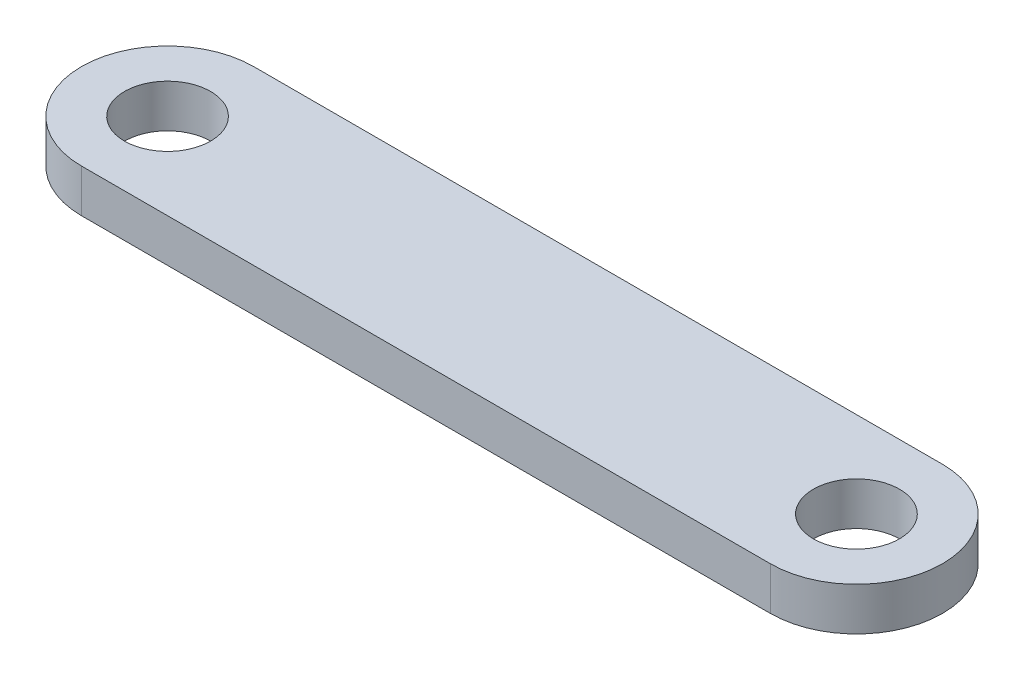
ISO-10303-21;
HEADER;
FILE_DESCRIPTION(('STEP AP214'),'2;1');
FILE_NAME('part.step','',(''),(''),'','','');
FILE_SCHEMA(('AUTOMOTIVE_DESIGN { 1 0 10303 214 1 1 1 1 }'));
ENDSEC;
DATA;
#1=APPLICATION_CONTEXT('core data for automotive mechanical design processes');
#2=APPLICATION_PROTOCOL_DEFINITION('international standard','automotive_design',2000,#1);
#3=PRODUCT_CONTEXT('',#1,'mechanical');
#4=PRODUCT('Part','Part','',(#3));
#5=PRODUCT_RELATED_PRODUCT_CATEGORY('part','',(#4));
#6=PRODUCT_DEFINITION_FORMATION('','',#4);
#7=PRODUCT_DEFINITION_CONTEXT('part definition',#1,'design');
#8=PRODUCT_DEFINITION('design','',#6,#7);
#9=PRODUCT_DEFINITION_SHAPE('','',#8);
#10=(LENGTH_UNIT() NAMED_UNIT(*) SI_UNIT(.MILLI.,.METRE.));
#11=(NAMED_UNIT(*) PLANE_ANGLE_UNIT() SI_UNIT($,.RADIAN.));
#12=(NAMED_UNIT(*) SI_UNIT($,.STERADIAN.) SOLID_ANGLE_UNIT());
#13=UNCERTAINTY_MEASURE_WITH_UNIT(LENGTH_MEASURE(1.E-05),#10,'distance_accuracy_value','');
#14=(GEOMETRIC_REPRESENTATION_CONTEXT(3) GLOBAL_UNCERTAINTY_ASSIGNED_CONTEXT((#13)) GLOBAL_UNIT_ASSIGNED_CONTEXT((#10,
#11,#12)) REPRESENTATION_CONTEXT('',''));
#15=CARTESIAN_POINT('',(0.,0.,0.));
#16=DIRECTION('',(0.,0.,1.));
#17=DIRECTION('',(1.,0.,0.));
#18=AXIS2_PLACEMENT_3D('',#15,#16,#17);
#19=CARTESIAN_POINT('',(-16.,1.,0.));
#20=DIRECTION('',(0.,1.,0.));
#21=DIRECTION('',(0.,0.,1.));
#22=AXIS2_PLACEMENT_3D('',#19,#20,#21);
#23=PLANE('',#22);
#24=CARTESIAN_POINT('',(-16.,1.,0.));
#25=DIRECTION('',(0.,1.,0.));
#26=DIRECTION('',(0.,0.,1.));
#27=AXIS2_PLACEMENT_3D('',#24,#25,#26);
#28=CIRCLE('',#27,2.);
#29=CARTESIAN_POINT('',(-16.,1.,2.));
#30=VERTEX_POINT('',#29);
#31=EDGE_CURVE('E115',#30,#30,#28,.T.);
#32=ORIENTED_EDGE('',*,*,#31,.F.);
#33=EDGE_LOOP('',(#32));
#34=FACE_BOUND('',#33,.T.);
#35=CARTESIAN_POINT('',(-16.,1.,0.));
#36=DIRECTION('',(0.,1.,0.));
#37=DIRECTION('',(0.,0.,1.));
#38=AXIS2_PLACEMENT_3D('',#35,#36,#37);
#39=CIRCLE('',#38,4.00000000000001);
#40=CARTESIAN_POINT('',(-16.,1.,-4.00000000000001));
#41=VERTEX_POINT('',#40);
#42=CARTESIAN_POINT('',(-16.,1.,4.00000000000001));
#43=VERTEX_POINT('',#42);
#44=EDGE_CURVE('E95',#41,#43,#39,.T.);
#45=ORIENTED_EDGE('',*,*,#44,.T.);
#46=DIRECTION('',(1.,0.,0.));
#47=VECTOR('',#46,1.);
#48=CARTESIAN_POINT('',(-16.,1.,4.00000000000001));
#49=LINE('',#48,#47);
#50=CARTESIAN_POINT('',(16.,1.,4.));
#51=VERTEX_POINT('',#50);
#52=EDGE_CURVE('E90',#43,#51,#49,.T.);
#53=ORIENTED_EDGE('',*,*,#52,.T.);
#54=CARTESIAN_POINT('',(16.,1.,0.));
#55=DIRECTION('',(0.,1.,0.));
#56=DIRECTION('',(0.,0.,1.));
#57=AXIS2_PLACEMENT_3D('',#54,#55,#56);
#58=CIRCLE('',#57,4.00000000000001);
#59=CARTESIAN_POINT('',(16.,1.,-4.00000000000001));
#60=VERTEX_POINT('',#59);
#61=EDGE_CURVE('E93',#51,#60,#58,.T.);
#62=ORIENTED_EDGE('',*,*,#61,.T.);
#63=DIRECTION('',(-1.,0.,0.));
#64=VECTOR('',#63,1.);
#65=CARTESIAN_POINT('',(-16.,1.,-4.00000000000001));
#66=LINE('',#65,#64);
#67=EDGE_CURVE('E60',#60,#41,#66,.T.);
#68=ORIENTED_EDGE('',*,*,#67,.T.);
#69=EDGE_LOOP('',(#45,#53,#62,#68));
#70=FACE_BOUND('',#69,.T.);
#71=CARTESIAN_POINT('',(16.,1.,0.));
#72=DIRECTION('',(0.,1.,0.));
#73=DIRECTION('',(0.,0.,1.));
#74=AXIS2_PLACEMENT_3D('',#71,#72,#73);
#75=CIRCLE('',#74,2.);
#76=CARTESIAN_POINT('',(16.,1.,2.));
#77=VERTEX_POINT('',#76);
#78=EDGE_CURVE('E137',#77,#77,#75,.T.);
#79=ORIENTED_EDGE('',*,*,#78,.F.);
#80=EDGE_LOOP('',(#79));
#81=FACE_BOUND('',#80,.T.);
#82=ADVANCED_FACE('F42',(#34,#70,#81),#23,.T.);
#83=CARTESIAN_POINT('',(-16.,-1.,0.));
#84=DIRECTION('',(0.,1.,0.));
#85=DIRECTION('',(0.,0.,1.));
#86=AXIS2_PLACEMENT_3D('',#83,#84,#85);
#87=PLANE('',#86);
#88=CARTESIAN_POINT('',(-16.,-1.,0.));
#89=DIRECTION('',(0.,1.,0.));
#90=DIRECTION('',(0.,0.,1.));
#91=AXIS2_PLACEMENT_3D('',#88,#89,#90);
#92=CIRCLE('',#91,4.00000000000001);
#93=CARTESIAN_POINT('',(-16.,-1.,-4.00000000000001));
#94=VERTEX_POINT('',#93);
#95=CARTESIAN_POINT('',(-16.,-1.,4.00000000000001));
#96=VERTEX_POINT('',#95);
#97=EDGE_CURVE('E111',#94,#96,#92,.T.);
#98=ORIENTED_EDGE('',*,*,#97,.F.);
#99=DIRECTION('',(-1.,0.,0.));
#100=VECTOR('',#99,1.);
#101=CARTESIAN_POINT('',(-16.,-1.,-4.00000000000001));
#102=LINE('',#101,#100);
#103=CARTESIAN_POINT('',(16.,-1.,-4.00000000000001));
#104=VERTEX_POINT('',#103);
#105=EDGE_CURVE('E83',#104,#94,#102,.T.);
#106=ORIENTED_EDGE('',*,*,#105,.F.);
#107=CARTESIAN_POINT('',(16.,-1.,0.));
#108=DIRECTION('',(0.,1.,0.));
#109=DIRECTION('',(0.,0.,1.));
#110=AXIS2_PLACEMENT_3D('',#107,#108,#109);
#111=CIRCLE('',#110,4.00000000000001);
#112=CARTESIAN_POINT('',(16.,-1.,4.));
#113=VERTEX_POINT('',#112);
#114=EDGE_CURVE('E77',#113,#104,#111,.T.);
#115=ORIENTED_EDGE('',*,*,#114,.F.);
#116=DIRECTION('',(1.,0.,0.));
#117=VECTOR('',#116,1.);
#118=CARTESIAN_POINT('',(-16.,-1.,4.00000000000001));
#119=LINE('',#118,#117);
#120=EDGE_CURVE('E100',#96,#113,#119,.T.);
#121=ORIENTED_EDGE('',*,*,#120,.F.);
#122=EDGE_LOOP('',(#98,#106,#115,#121));
#123=FACE_BOUND('',#122,.T.);
#124=CARTESIAN_POINT('',(-16.,-1.,0.));
#125=DIRECTION('',(0.,1.,0.));
#126=DIRECTION('',(0.,0.,1.));
#127=AXIS2_PLACEMENT_3D('',#124,#125,#126);
#128=CIRCLE('',#127,2.);
#129=CARTESIAN_POINT('',(-16.,-1.,2.));
#130=VERTEX_POINT('',#129);
#131=EDGE_CURVE('E133',#130,#130,#128,.T.);
#132=ORIENTED_EDGE('',*,*,#131,.T.);
#133=EDGE_LOOP('',(#132));
#134=FACE_BOUND('',#133,.T.);
#135=CARTESIAN_POINT('',(16.,-1.,0.));
#136=DIRECTION('',(0.,1.,0.));
#137=DIRECTION('',(0.,0.,1.));
#138=AXIS2_PLACEMENT_3D('',#135,#136,#137);
#139=CIRCLE('',#138,2.);
#140=CARTESIAN_POINT('',(16.,-1.,2.));
#141=VERTEX_POINT('',#140);
#142=EDGE_CURVE('E141',#141,#141,#139,.T.);
#143=ORIENTED_EDGE('',*,*,#142,.T.);
#144=EDGE_LOOP('',(#143));
#145=FACE_BOUND('',#144,.T.);
#146=ADVANCED_FACE('F128',(#123,#134,#145),#87,.F.);
#147=CARTESIAN_POINT('',(-16.,1.,0.));
#148=DIRECTION('',(0.,-1.,0.));
#149=DIRECTION('',(0.,0.,-1.));
#150=AXIS2_PLACEMENT_3D('',#147,#148,#149);
#151=CYLINDRICAL_SURFACE('',#150,4.00000000000001);
#152=ORIENTED_EDGE('',*,*,#97,.T.);
#153=DIRECTION('',(0.,-1.,0.));
#154=VECTOR('',#153,1.);
#155=CARTESIAN_POINT('',(-16.,1.,4.00000000000001));
#156=LINE('',#155,#154);
#157=EDGE_CURVE('E11',#43,#96,#156,.T.);
#158=ORIENTED_EDGE('',*,*,#157,.F.);
#159=ORIENTED_EDGE('',*,*,#44,.F.);
#160=DIRECTION('',(0.,-1.,0.));
#161=VECTOR('',#160,1.);
#162=CARTESIAN_POINT('',(-16.,1.,-4.00000000000001));
#163=LINE('',#162,#161);
#164=EDGE_CURVE('E107',#41,#94,#163,.T.);
#165=ORIENTED_EDGE('',*,*,#164,.T.);
#166=EDGE_LOOP('',(#152,#158,#159,#165));
#167=FACE_BOUND('',#166,.T.);
#168=ADVANCED_FACE('F44',(#167),#151,.T.);
#169=CARTESIAN_POINT('',(-16.,1.,4.00000000000001));
#170=DIRECTION('',(0.,0.,-1.));
#171=DIRECTION('',(-1.,0.,0.));
#172=AXIS2_PLACEMENT_3D('',#169,#170,#171);
#173=PLANE('',#172);
#174=ORIENTED_EDGE('',*,*,#120,.T.);
#175=DIRECTION('',(0.,-1.,0.));
#176=VECTOR('',#175,1.);
#177=CARTESIAN_POINT('',(16.,1.,4.));
#178=LINE('',#177,#176);
#179=EDGE_CURVE('E52',#51,#113,#178,.T.);
#180=ORIENTED_EDGE('',*,*,#179,.F.);
#181=ORIENTED_EDGE('',*,*,#52,.F.);
#182=ORIENTED_EDGE('',*,*,#157,.T.);
#183=EDGE_LOOP('',(#174,#180,#181,#182));
#184=FACE_BOUND('',#183,.T.);
#185=ADVANCED_FACE('F99',(#184),#173,.F.);
#186=CARTESIAN_POINT('',(16.,1.,0.));
#187=DIRECTION('',(0.,-1.,0.));
#188=DIRECTION('',(0.,0.,-1.));
#189=AXIS2_PLACEMENT_3D('',#186,#187,#188);
#190=CYLINDRICAL_SURFACE('',#189,4.00000000000001);
#191=ORIENTED_EDGE('',*,*,#114,.T.);
#192=DIRECTION('',(0.,-1.,0.));
#193=VECTOR('',#192,1.);
#194=CARTESIAN_POINT('',(16.,1.,-4.00000000000001));
#195=LINE('',#194,#193);
#196=EDGE_CURVE('E102',#60,#104,#195,.T.);
#197=ORIENTED_EDGE('',*,*,#196,.F.);
#198=ORIENTED_EDGE('',*,*,#61,.F.);
#199=ORIENTED_EDGE('',*,*,#179,.T.);
#200=EDGE_LOOP('',(#191,#197,#198,#199));
#201=FACE_BOUND('',#200,.T.);
#202=ADVANCED_FACE('F103',(#201),#190,.T.);
#203=CARTESIAN_POINT('',(-16.,1.,-4.00000000000001));
#204=DIRECTION('',(0.,0.,1.));
#205=DIRECTION('',(1.,0.,0.));
#206=AXIS2_PLACEMENT_3D('',#203,#204,#205);
#207=PLANE('',#206);
#208=ORIENTED_EDGE('',*,*,#105,.T.);
#209=ORIENTED_EDGE('',*,*,#164,.F.);
#210=ORIENTED_EDGE('',*,*,#67,.F.);
#211=ORIENTED_EDGE('',*,*,#196,.T.);
#212=EDGE_LOOP('',(#208,#209,#210,#211));
#213=FACE_BOUND('',#212,.T.);
#214=ADVANCED_FACE('F125',(#213),#207,.F.);
#215=CARTESIAN_POINT('',(-16.,1.,0.));
#216=DIRECTION('',(0.,-1.,0.));
#217=DIRECTION('',(0.,0.,-1.));
#218=AXIS2_PLACEMENT_3D('',#215,#216,#217);
#219=CYLINDRICAL_SURFACE('',#218,2.);
#220=ORIENTED_EDGE('',*,*,#31,.T.);
#221=EDGE_LOOP('',(#220));
#222=FACE_BOUND('',#221,.T.);
#223=ORIENTED_EDGE('',*,*,#131,.F.);
#224=EDGE_LOOP('',(#223));
#225=FACE_BOUND('',#224,.T.);
#226=ADVANCED_FACE('F160',(#222,#225),#219,.F.);
#227=CARTESIAN_POINT('',(16.,1.,0.));
#228=DIRECTION('',(0.,-1.,0.));
#229=DIRECTION('',(0.,0.,-1.));
#230=AXIS2_PLACEMENT_3D('',#227,#228,#229);
#231=CYLINDRICAL_SURFACE('',#230,2.);
#232=ORIENTED_EDGE('',*,*,#78,.T.);
#233=EDGE_LOOP('',(#232));
#234=FACE_BOUND('',#233,.T.);
#235=ORIENTED_EDGE('',*,*,#142,.F.);
#236=EDGE_LOOP('',(#235));
#237=FACE_BOUND('',#236,.T.);
#238=ADVANCED_FACE('F149',(#234,#237),#231,.F.);
#239=CLOSED_SHELL('',(#82,#146,#168,#185,#202,#214,#226,#238));
#240=MANIFOLD_SOLID_BREP('B2',#239);
#241=ADVANCED_BREP_SHAPE_REPRESENTATION('',(#18,#240),#14);
#242=SHAPE_DEFINITION_REPRESENTATION(#9,#241);
ENDSEC;
END-ISO-10303-21;
